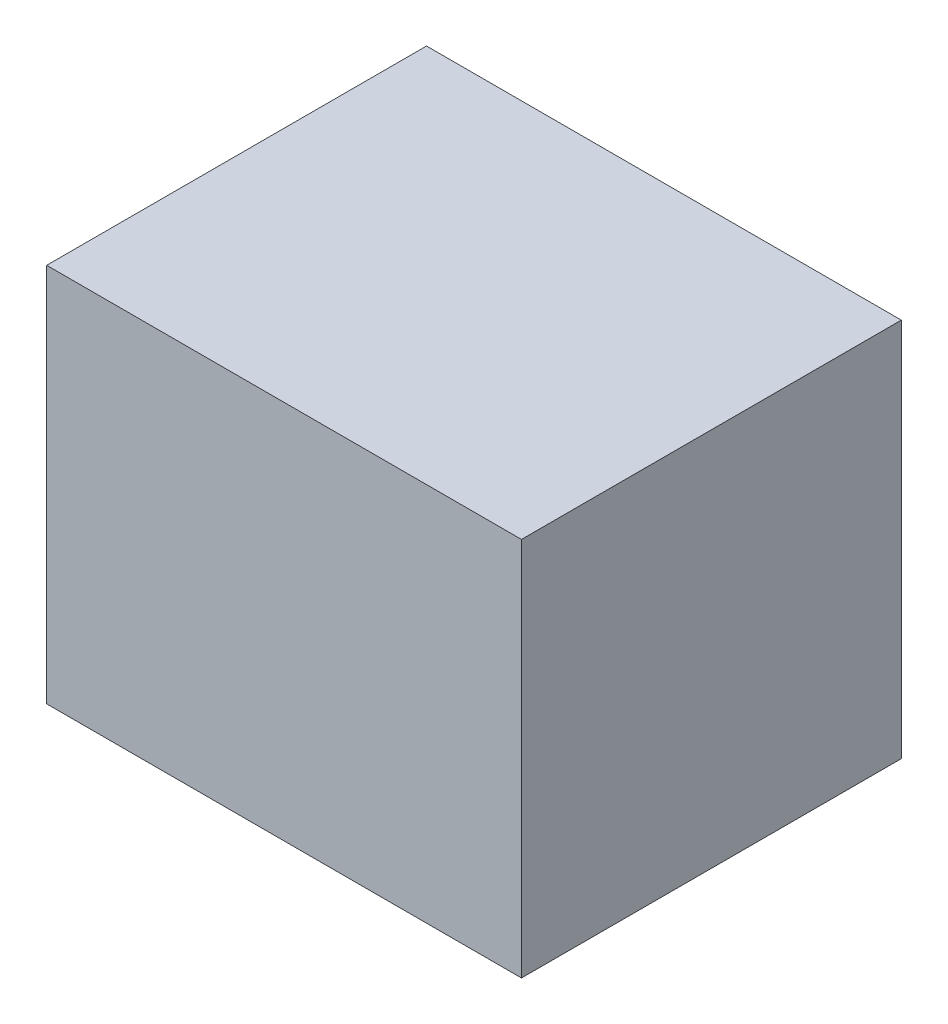
ISO-10303-21;
HEADER;
FILE_DESCRIPTION(('STEP AP214'),'2;1');
FILE_NAME('part.step','',(''),(''),'','','');
FILE_SCHEMA(('AUTOMOTIVE_DESIGN { 1 0 10303 214 1 1 1 1 }'));
ENDSEC;
DATA;
#1=APPLICATION_CONTEXT('core data for automotive mechanical design processes');
#2=APPLICATION_PROTOCOL_DEFINITION('international standard','automotive_design',2000,#1);
#3=PRODUCT_CONTEXT('',#1,'mechanical');
#4=PRODUCT('Part','Part','',(#3));
#5=PRODUCT_RELATED_PRODUCT_CATEGORY('part','',(#4));
#6=PRODUCT_DEFINITION_FORMATION('','',#4);
#7=PRODUCT_DEFINITION_CONTEXT('part definition',#1,'design');
#8=PRODUCT_DEFINITION('design','',#6,#7);
#9=PRODUCT_DEFINITION_SHAPE('','',#8);
#10=(LENGTH_UNIT() NAMED_UNIT(*) SI_UNIT(.MILLI.,.METRE.));
#11=(NAMED_UNIT(*) PLANE_ANGLE_UNIT() SI_UNIT($,.RADIAN.));
#12=(NAMED_UNIT(*) SI_UNIT($,.STERADIAN.) SOLID_ANGLE_UNIT());
#13=UNCERTAINTY_MEASURE_WITH_UNIT(LENGTH_MEASURE(1.E-05),#10,'distance_accuracy_value','');
#14=(GEOMETRIC_REPRESENTATION_CONTEXT(3) GLOBAL_UNCERTAINTY_ASSIGNED_CONTEXT((#13)) GLOBAL_UNIT_ASSIGNED_CONTEXT((#10,
#11,#12)) REPRESENTATION_CONTEXT('',''));
#15=CARTESIAN_POINT('',(0.,0.,0.));
#16=DIRECTION('',(0.,0.,1.));
#17=DIRECTION('',(1.,0.,0.));
#18=AXIS2_PLACEMENT_3D('',#15,#16,#17);
#19=CARTESIAN_POINT('',(12.5,10.,-10.));
#20=DIRECTION('',(-1.,0.,0.));
#21=DIRECTION('',(0.,0.,1.));
#22=AXIS2_PLACEMENT_3D('',#19,#20,#21);
#23=PLANE('',#22);
#24=DIRECTION('',(0.,0.,-1.));
#25=VECTOR('',#24,1.);
#26=CARTESIAN_POINT('',(12.5,-10.,-10.));
#27=LINE('',#26,#25);
#28=CARTESIAN_POINT('',(12.5,-10.,10.));
#29=VERTEX_POINT('',#28);
#30=CARTESIAN_POINT('',(12.5,-10.,-10.));
#31=VERTEX_POINT('',#30);
#32=EDGE_CURVE('E107',#29,#31,#27,.T.);
#33=ORIENTED_EDGE('',*,*,#32,.T.);
#34=DIRECTION('',(0.,-1.,0.));
#35=VECTOR('',#34,1.);
#36=CARTESIAN_POINT('',(12.5,10.,-10.));
#37=LINE('',#36,#35);
#38=CARTESIAN_POINT('',(12.5,10.,-10.));
#39=VERTEX_POINT('',#38);
#40=EDGE_CURVE('E11',#39,#31,#37,.T.);
#41=ORIENTED_EDGE('',*,*,#40,.F.);
#42=DIRECTION('',(0.,0.,-1.));
#43=VECTOR('',#42,1.);
#44=CARTESIAN_POINT('',(12.5,10.,-10.));
#45=LINE('',#44,#43);
#46=CARTESIAN_POINT('',(12.5,10.,10.));
#47=VERTEX_POINT('',#46);
#48=EDGE_CURVE('E91',#47,#39,#45,.T.);
#49=ORIENTED_EDGE('',*,*,#48,.F.);
#50=DIRECTION('',(0.,-1.,0.));
#51=VECTOR('',#50,1.);
#52=CARTESIAN_POINT('',(12.5,10.,10.));
#53=LINE('',#52,#51);
#54=EDGE_CURVE('E103',#47,#29,#53,.T.);
#55=ORIENTED_EDGE('',*,*,#54,.T.);
#56=EDGE_LOOP('',(#33,#41,#49,#55));
#57=FACE_BOUND('',#56,.T.);
#58=ADVANCED_FACE('F39',(#57),#23,.F.);
#59=CARTESIAN_POINT('',(-12.5,10.,-10.));
#60=DIRECTION('',(0.,0.,1.));
#61=DIRECTION('',(1.,0.,0.));
#62=AXIS2_PLACEMENT_3D('',#59,#60,#61);
#63=PLANE('',#62);
#64=DIRECTION('',(-1.,0.,0.));
#65=VECTOR('',#64,1.);
#66=CARTESIAN_POINT('',(-12.5,-10.,-10.));
#67=LINE('',#66,#65);
#68=CARTESIAN_POINT('',(-12.5,-10.,-10.));
#69=VERTEX_POINT('',#68);
#70=EDGE_CURVE('E96',#31,#69,#67,.T.);
#71=ORIENTED_EDGE('',*,*,#70,.T.);
#72=DIRECTION('',(0.,-1.,0.));
#73=VECTOR('',#72,1.);
#74=CARTESIAN_POINT('',(-12.5,10.,-10.));
#75=LINE('',#74,#73);
#76=CARTESIAN_POINT('',(-12.5,10.,-10.));
#77=VERTEX_POINT('',#76);
#78=EDGE_CURVE('E48',#77,#69,#75,.T.);
#79=ORIENTED_EDGE('',*,*,#78,.F.);
#80=DIRECTION('',(-1.,0.,0.));
#81=VECTOR('',#80,1.);
#82=CARTESIAN_POINT('',(-12.5,10.,-10.));
#83=LINE('',#82,#81);
#84=EDGE_CURVE('E86',#39,#77,#83,.T.);
#85=ORIENTED_EDGE('',*,*,#84,.F.);
#86=ORIENTED_EDGE('',*,*,#40,.T.);
#87=EDGE_LOOP('',(#71,#79,#85,#86));
#88=FACE_BOUND('',#87,.T.);
#89=ADVANCED_FACE('F95',(#88),#63,.F.);
#90=CARTESIAN_POINT('',(-12.5,10.,-10.));
#91=DIRECTION('',(1.,0.,0.));
#92=DIRECTION('',(0.,0.,-1.));
#93=AXIS2_PLACEMENT_3D('',#90,#91,#92);
#94=PLANE('',#93);
#95=DIRECTION('',(0.,0.,1.));
#96=VECTOR('',#95,1.);
#97=CARTESIAN_POINT('',(-12.5,-10.,-10.));
#98=LINE('',#97,#96);
#99=CARTESIAN_POINT('',(-12.5,-10.,10.));
#100=VERTEX_POINT('',#99);
#101=EDGE_CURVE('E73',#69,#100,#98,.T.);
#102=ORIENTED_EDGE('',*,*,#101,.T.);
#103=DIRECTION('',(0.,-1.,0.));
#104=VECTOR('',#103,1.);
#105=CARTESIAN_POINT('',(-12.5,10.,10.));
#106=LINE('',#105,#104);
#107=CARTESIAN_POINT('',(-12.5,10.,10.));
#108=VERTEX_POINT('',#107);
#109=EDGE_CURVE('E98',#108,#100,#106,.T.);
#110=ORIENTED_EDGE('',*,*,#109,.F.);
#111=DIRECTION('',(0.,0.,1.));
#112=VECTOR('',#111,1.);
#113=CARTESIAN_POINT('',(-12.5,10.,-10.));
#114=LINE('',#113,#112);
#115=EDGE_CURVE('E89',#77,#108,#114,.T.);
#116=ORIENTED_EDGE('',*,*,#115,.F.);
#117=ORIENTED_EDGE('',*,*,#78,.T.);
#118=EDGE_LOOP('',(#102,#110,#116,#117));
#119=FACE_BOUND('',#118,.T.);
#120=ADVANCED_FACE('F99',(#119),#94,.F.);
#121=CARTESIAN_POINT('',(-12.5,10.,10.));
#122=DIRECTION('',(0.,0.,-1.));
#123=DIRECTION('',(-1.,0.,0.));
#124=AXIS2_PLACEMENT_3D('',#121,#122,#123);
#125=PLANE('',#124);
#126=DIRECTION('',(1.,0.,0.));
#127=VECTOR('',#126,1.);
#128=CARTESIAN_POINT('',(-12.5,-10.,10.));
#129=LINE('',#128,#127);
#130=EDGE_CURVE('E79',#100,#29,#129,.T.);
#131=ORIENTED_EDGE('',*,*,#130,.T.);
#132=ORIENTED_EDGE('',*,*,#54,.F.);
#133=DIRECTION('',(1.,0.,0.));
#134=VECTOR('',#133,1.);
#135=CARTESIAN_POINT('',(-12.5,10.,10.));
#136=LINE('',#135,#134);
#137=EDGE_CURVE('E56',#108,#47,#136,.T.);
#138=ORIENTED_EDGE('',*,*,#137,.F.);
#139=ORIENTED_EDGE('',*,*,#109,.T.);
#140=EDGE_LOOP('',(#131,#132,#138,#139));
#141=FACE_BOUND('',#140,.T.);
#142=ADVANCED_FACE('F120',(#141),#125,.F.);
#143=CARTESIAN_POINT('',(0.,10.,0.));
#144=DIRECTION('',(0.,1.,0.));
#145=DIRECTION('',(0.,0.,1.));
#146=AXIS2_PLACEMENT_3D('',#143,#144,#145);
#147=PLANE('',#146);
#148=ORIENTED_EDGE('',*,*,#48,.T.);
#149=ORIENTED_EDGE('',*,*,#84,.T.);
#150=ORIENTED_EDGE('',*,*,#115,.T.);
#151=ORIENTED_EDGE('',*,*,#137,.T.);
#152=EDGE_LOOP('',(#148,#149,#150,#151));
#153=FACE_BOUND('',#152,.T.);
#154=ADVANCED_FACE('F87',(#153),#147,.T.);
#155=CARTESIAN_POINT('',(0.,-10.,0.));
#156=DIRECTION('',(0.,1.,0.));
#157=DIRECTION('',(0.,0.,1.));
#158=AXIS2_PLACEMENT_3D('',#155,#156,#157);
#159=PLANE('',#158);
#160=ORIENTED_EDGE('',*,*,#32,.F.);
#161=ORIENTED_EDGE('',*,*,#130,.F.);
#162=ORIENTED_EDGE('',*,*,#101,.F.);
#163=ORIENTED_EDGE('',*,*,#70,.F.);
#164=EDGE_LOOP('',(#160,#161,#162,#163));
#165=FACE_BOUND('',#164,.T.);
#166=ADVANCED_FACE('F123',(#165),#159,.F.);
#167=CLOSED_SHELL('',(#58,#89,#120,#142,#154,#166));
#168=MANIFOLD_SOLID_BREP('B2',#167);
#169=ADVANCED_BREP_SHAPE_REPRESENTATION('',(#18,#168),#14);
#170=SHAPE_DEFINITION_REPRESENTATION(#9,#169);
ENDSEC;
END-ISO-10303-21;
